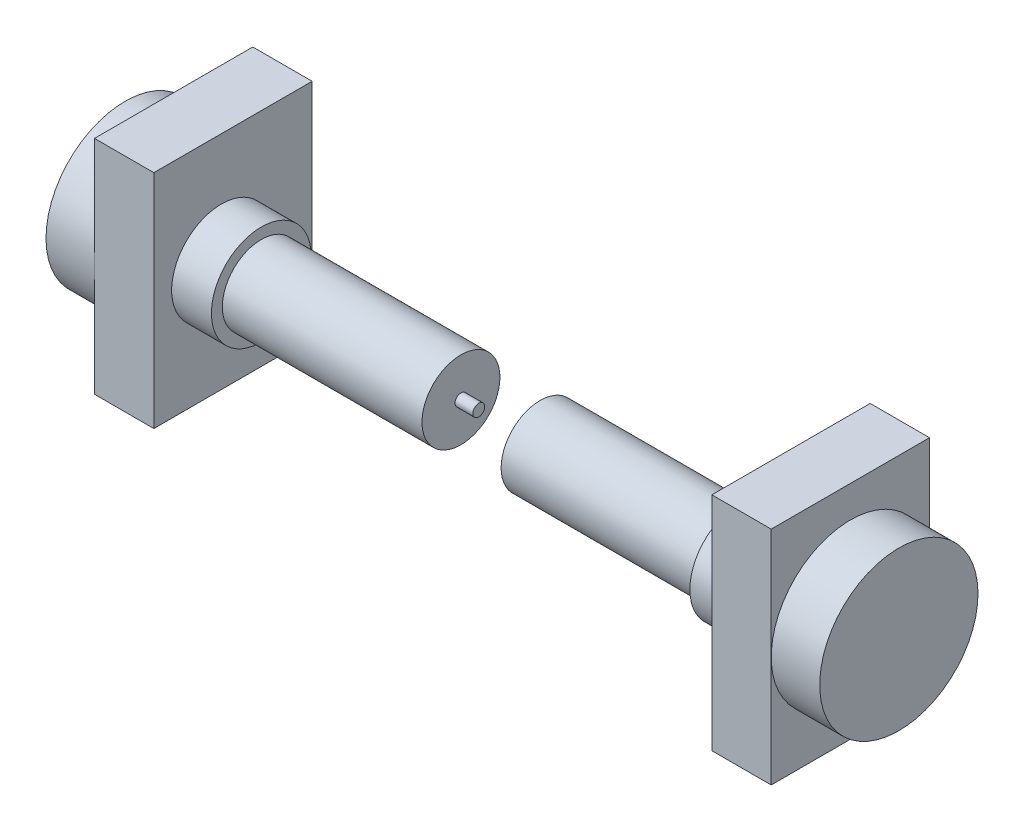
ISO-10303-21;
HEADER;
FILE_DESCRIPTION(('STEP AP214'),'2;1');
FILE_NAME('part.step','',(''),(''),'','','');
FILE_SCHEMA(('AUTOMOTIVE_DESIGN { 1 0 10303 214 1 1 1 1 }'));
ENDSEC;
DATA;
#1=APPLICATION_CONTEXT('core data for automotive mechanical design processes');
#2=APPLICATION_PROTOCOL_DEFINITION('international standard','automotive_design',2000,#1);
#3=PRODUCT_CONTEXT('',#1,'mechanical');
#4=PRODUCT('Part','Part','',(#3));
#5=PRODUCT_RELATED_PRODUCT_CATEGORY('part','',(#4));
#6=PRODUCT_DEFINITION_FORMATION('','',#4);
#7=PRODUCT_DEFINITION_CONTEXT('part definition',#1,'design');
#8=PRODUCT_DEFINITION('design','',#6,#7);
#9=PRODUCT_DEFINITION_SHAPE('','',#8);
#10=(LENGTH_UNIT() NAMED_UNIT(*) SI_UNIT(.MILLI.,.METRE.));
#11=(NAMED_UNIT(*) PLANE_ANGLE_UNIT() SI_UNIT($,.RADIAN.));
#12=(NAMED_UNIT(*) SI_UNIT($,.STERADIAN.) SOLID_ANGLE_UNIT());
#13=UNCERTAINTY_MEASURE_WITH_UNIT(LENGTH_MEASURE(1.E-05),#10,'distance_accuracy_value','');
#14=(GEOMETRIC_REPRESENTATION_CONTEXT(3) GLOBAL_UNCERTAINTY_ASSIGNED_CONTEXT((#13)) GLOBAL_UNIT_ASSIGNED_CONTEXT((#10,
#11,#12)) REPRESENTATION_CONTEXT('',''));
#15=CARTESIAN_POINT('',(0.,0.,0.));
#16=DIRECTION('',(0.,0.,1.));
#17=DIRECTION('',(1.,0.,0.));
#18=AXIS2_PLACEMENT_3D('',#15,#16,#17);
#19=CARTESIAN_POINT('',(5.5,0.,25.9));
#20=DIRECTION('',(1.,0.,0.));
#21=DIRECTION('',(0.,0.,-1.));
#22=AXIS2_PLACEMENT_3D('',#19,#20,#21);
#23=CYLINDRICAL_SURFACE('',#22,1.5);
#24=CARTESIAN_POINT('',(5.5,0.,25.9));
#25=DIRECTION('',(-1.,0.,0.));
#26=DIRECTION('',(0.,0.,1.));
#27=AXIS2_PLACEMENT_3D('',#24,#25,#26);
#28=CIRCLE('',#27,1.5);
#29=CARTESIAN_POINT('',(5.5,0.,27.4));
#30=VERTEX_POINT('',#29);
#31=EDGE_CURVE('E11',#30,#30,#28,.T.);
#32=ORIENTED_EDGE('',*,*,#31,.F.);
#33=EDGE_LOOP('',(#32));
#34=FACE_BOUND('',#33,.T.);
#35=CARTESIAN_POINT('',(10.,0.,25.9));
#36=DIRECTION('',(-1.,0.,0.));
#37=DIRECTION('',(0.,0.,1.));
#38=AXIS2_PLACEMENT_3D('',#35,#36,#37);
#39=CIRCLE('',#38,1.5);
#40=CARTESIAN_POINT('',(10.,0.,27.4));
#41=VERTEX_POINT('',#40);
#42=EDGE_CURVE('E43',#41,#41,#39,.T.);
#43=ORIENTED_EDGE('',*,*,#42,.T.);
#44=EDGE_LOOP('',(#43));
#45=FACE_BOUND('',#44,.T.);
#46=ADVANCED_FACE('F40',(#34,#45),#23,.T.);
#47=CARTESIAN_POINT('',(5.5,0.,25.9));
#48=DIRECTION('',(-1.,0.,0.));
#49=DIRECTION('',(0.,0.,1.));
#50=AXIS2_PLACEMENT_3D('',#47,#48,#49);
#51=PLANE('',#50);
#52=ORIENTED_EDGE('',*,*,#31,.T.);
#53=EDGE_LOOP('',(#52));
#54=FACE_BOUND('',#53,.T.);
#55=ADVANCED_FACE('F55',(#54),#51,.T.);
#56=CARTESIAN_POINT('',(10.,0.,25.9));
#57=DIRECTION('',(-1.,0.,0.));
#58=DIRECTION('',(0.,0.,1.));
#59=AXIS2_PLACEMENT_3D('',#56,#57,#58);
#60=PLANE('',#59);
#61=ORIENTED_EDGE('',*,*,#42,.F.);
#62=EDGE_LOOP('',(#61));
#63=FACE_BOUND('',#62,.T.);
#64=ADVANCED_FACE('F53',(#63),#60,.F.);
#65=CLOSED_SHELL('',(#46,#55,#64));
#66=MANIFOLD_SOLID_BREP('B2',#65);
#67=CARTESIAN_POINT('',(-10.,0.,25.9));
#68=DIRECTION('',(-1.,0.,0.));
#69=DIRECTION('',(0.,0.,1.));
#70=AXIS2_PLACEMENT_3D('',#67,#68,#69);
#71=CYLINDRICAL_SURFACE('',#70,9.85);
#72=CARTESIAN_POINT('',(-10.,0.,25.9));
#73=DIRECTION('',(1.,0.,0.));
#74=DIRECTION('',(0.,0.,-1.));
#75=AXIS2_PLACEMENT_3D('',#72,#73,#74);
#76=CIRCLE('',#75,9.85);
#77=CARTESIAN_POINT('',(-10.,0.,16.05));
#78=VERTEX_POINT('',#77);
#79=EDGE_CURVE('E39',#78,#78,#76,.T.);
#80=ORIENTED_EDGE('',*,*,#79,.F.);
#81=EDGE_LOOP('',(#80));
#82=FACE_BOUND('',#81,.T.);
#83=CARTESIAN_POINT('',(-60.45,0.,25.9));
#84=DIRECTION('',(1.,0.,0.));
#85=DIRECTION('',(0.,0.,-1.));
#86=AXIS2_PLACEMENT_3D('',#83,#84,#85);
#87=CIRCLE('',#86,9.85);
#88=CARTESIAN_POINT('',(-60.45,0.,16.05));
#89=VERTEX_POINT('',#88);
#90=EDGE_CURVE('E92',#89,#89,#87,.T.);
#91=ORIENTED_EDGE('',*,*,#90,.T.);
#92=EDGE_LOOP('',(#91));
#93=FACE_BOUND('',#92,.T.);
#94=ADVANCED_FACE('F89',(#82,#93),#71,.T.);
#95=CARTESIAN_POINT('',(-10.,0.,25.9));
#96=DIRECTION('',(1.,0.,0.));
#97=DIRECTION('',(0.,0.,-1.));
#98=AXIS2_PLACEMENT_3D('',#95,#96,#97);
#99=PLANE('',#98);
#100=CARTESIAN_POINT('',(-10.,0.,25.9));
#101=DIRECTION('',(1.,0.,0.));
#102=DIRECTION('',(0.,0.,-1.));
#103=AXIS2_PLACEMENT_3D('',#100,#101,#102);
#104=CIRCLE('',#103,1.5);
#105=CARTESIAN_POINT('',(-10.,0.,24.4));
#106=VERTEX_POINT('',#105);
#107=EDGE_CURVE('E101',#106,#106,#104,.T.);
#108=ORIENTED_EDGE('',*,*,#107,.F.);
#109=EDGE_LOOP('',(#108));
#110=FACE_BOUND('',#109,.T.);
#111=ORIENTED_EDGE('',*,*,#79,.T.);
#112=EDGE_LOOP('',(#111));
#113=FACE_BOUND('',#112,.T.);
#114=ADVANCED_FACE('F116',(#110,#113),#99,.T.);
#115=CARTESIAN_POINT('',(-60.45,0.,25.9));
#116=DIRECTION('',(1.,0.,0.));
#117=DIRECTION('',(0.,0.,-1.));
#118=AXIS2_PLACEMENT_3D('',#115,#116,#117);
#119=PLANE('',#118);
#120=ORIENTED_EDGE('',*,*,#90,.F.);
#121=EDGE_LOOP('',(#120));
#122=FACE_BOUND('',#121,.T.);
#123=ADVANCED_FACE('F112',(#122),#119,.F.);
#124=CARTESIAN_POINT('',(-5.5,0.,25.9));
#125=DIRECTION('',(-1.,0.,0.));
#126=DIRECTION('',(0.,0.,1.));
#127=AXIS2_PLACEMENT_3D('',#124,#125,#126);
#128=CYLINDRICAL_SURFACE('',#127,1.5);
#129=CARTESIAN_POINT('',(-5.5,0.,25.9));
#130=DIRECTION('',(1.,0.,0.));
#131=DIRECTION('',(0.,0.,-1.));
#132=AXIS2_PLACEMENT_3D('',#129,#130,#131);
#133=CIRCLE('',#132,1.5);
#134=CARTESIAN_POINT('',(-5.5,0.,24.4));
#135=VERTEX_POINT('',#134);
#136=EDGE_CURVE('E99',#135,#135,#133,.T.);
#137=ORIENTED_EDGE('',*,*,#136,.F.);
#138=EDGE_LOOP('',(#137));
#139=FACE_BOUND('',#138,.T.);
#140=ORIENTED_EDGE('',*,*,#107,.T.);
#141=EDGE_LOOP('',(#140));
#142=FACE_BOUND('',#141,.T.);
#143=ADVANCED_FACE('F109',(#139,#142),#128,.T.);
#144=CARTESIAN_POINT('',(-5.5,0.,25.9));
#145=DIRECTION('',(1.,0.,0.));
#146=DIRECTION('',(0.,0.,-1.));
#147=AXIS2_PLACEMENT_3D('',#144,#145,#146);
#148=PLANE('',#147);
#149=ORIENTED_EDGE('',*,*,#136,.T.);
#150=EDGE_LOOP('',(#149));
#151=FACE_BOUND('',#150,.T.);
#152=ADVANCED_FACE('F107',(#151),#148,.T.);
#153=CLOSED_SHELL('',(#94,#114,#123,#143,#152));
#154=MANIFOLD_SOLID_BREP('B6',#153);
#155=CARTESIAN_POINT('',(10.,0.,25.9));
#156=DIRECTION('',(1.,0.,0.));
#157=DIRECTION('',(0.,0.,-1.));
#158=AXIS2_PLACEMENT_3D('',#155,#156,#157);
#159=CYLINDRICAL_SURFACE('',#158,9.85);
#160=CARTESIAN_POINT('',(10.,0.,25.9));
#161=DIRECTION('',(-1.,0.,0.));
#162=DIRECTION('',(0.,0.,1.));
#163=AXIS2_PLACEMENT_3D('',#160,#161,#162);
#164=CIRCLE('',#163,9.85);
#165=CARTESIAN_POINT('',(10.,0.,35.75));
#166=VERTEX_POINT('',#165);
#167=EDGE_CURVE('E88',#166,#166,#164,.T.);
#168=ORIENTED_EDGE('',*,*,#167,.F.);
#169=EDGE_LOOP('',(#168));
#170=FACE_BOUND('',#169,.T.);
#171=CARTESIAN_POINT('',(60.45,0.,25.9));
#172=DIRECTION('',(-1.,0.,0.));
#173=DIRECTION('',(0.,0.,1.));
#174=AXIS2_PLACEMENT_3D('',#171,#172,#173);
#175=CIRCLE('',#174,9.85);
#176=CARTESIAN_POINT('',(60.45,0.,35.75));
#177=VERTEX_POINT('',#176);
#178=EDGE_CURVE('E171',#177,#177,#175,.T.);
#179=ORIENTED_EDGE('',*,*,#178,.T.);
#180=EDGE_LOOP('',(#179));
#181=FACE_BOUND('',#180,.T.);
#182=ADVANCED_FACE('F168',(#170,#181),#159,.T.);
#183=CARTESIAN_POINT('',(10.,0.,25.9));
#184=DIRECTION('',(-1.,0.,0.));
#185=DIRECTION('',(0.,0.,1.));
#186=AXIS2_PLACEMENT_3D('',#183,#184,#185);
#187=PLANE('',#186);
#188=ORIENTED_EDGE('',*,*,#167,.T.);
#189=EDGE_LOOP('',(#188));
#190=FACE_BOUND('',#189,.T.);
#191=ADVANCED_FACE('F183',(#190),#187,.T.);
#192=CARTESIAN_POINT('',(60.45,0.,25.9));
#193=DIRECTION('',(-1.,0.,0.));
#194=DIRECTION('',(0.,0.,1.));
#195=AXIS2_PLACEMENT_3D('',#192,#193,#194);
#196=PLANE('',#195);
#197=ORIENTED_EDGE('',*,*,#178,.F.);
#198=EDGE_LOOP('',(#197));
#199=FACE_BOUND('',#198,.T.);
#200=ADVANCED_FACE('F181',(#199),#196,.F.);
#201=CLOSED_SHELL('',(#182,#191,#200));
#202=MANIFOLD_SOLID_BREP('B34',#201);
#203=CARTESIAN_POINT('',(-60.45,0.,25.9));
#204=DIRECTION('',(-1.,0.,0.));
#205=DIRECTION('',(0.,0.,1.));
#206=AXIS2_PLACEMENT_3D('',#203,#204,#205);
#207=CYLINDRICAL_SURFACE('',#206,12.6);
#208=CARTESIAN_POINT('',(-60.45,0.,25.9));
#209=DIRECTION('',(1.,0.,0.));
#210=DIRECTION('',(0.,0.,-1.));
#211=AXIS2_PLACEMENT_3D('',#208,#209,#210);
#212=CIRCLE('',#211,12.6);
#213=CARTESIAN_POINT('',(-60.45,0.,13.3));
#214=VERTEX_POINT('',#213);
#215=EDGE_CURVE('E167',#214,#214,#212,.T.);
#216=ORIENTED_EDGE('',*,*,#215,.F.);
#217=EDGE_LOOP('',(#216));
#218=FACE_BOUND('',#217,.T.);
#219=CARTESIAN_POINT('',(-70.5,0.,25.9));
#220=DIRECTION('',(1.,0.,0.));
#221=DIRECTION('',(0.,0.,-1.));
#222=AXIS2_PLACEMENT_3D('',#219,#220,#221);
#223=CIRCLE('',#222,12.6);
#224=CARTESIAN_POINT('',(-70.5,0.,13.3));
#225=VERTEX_POINT('',#224);
#226=EDGE_CURVE('E220',#225,#225,#223,.T.);
#227=ORIENTED_EDGE('',*,*,#226,.T.);
#228=EDGE_LOOP('',(#227));
#229=FACE_BOUND('',#228,.T.);
#230=ADVANCED_FACE('F217',(#218,#229),#207,.T.);
#231=CARTESIAN_POINT('',(-60.45,0.,25.9));
#232=DIRECTION('',(1.,0.,0.));
#233=DIRECTION('',(0.,0.,-1.));
#234=AXIS2_PLACEMENT_3D('',#231,#232,#233);
#235=PLANE('',#234);
#236=ORIENTED_EDGE('',*,*,#215,.T.);
#237=EDGE_LOOP('',(#236));
#238=FACE_BOUND('',#237,.T.);
#239=ADVANCED_FACE('F232',(#238),#235,.T.);
#240=CARTESIAN_POINT('',(-70.5,0.,25.9));
#241=DIRECTION('',(1.,0.,0.));
#242=DIRECTION('',(0.,0.,-1.));
#243=AXIS2_PLACEMENT_3D('',#240,#241,#242);
#244=PLANE('',#243);
#245=ORIENTED_EDGE('',*,*,#226,.F.);
#246=EDGE_LOOP('',(#245));
#247=FACE_BOUND('',#246,.T.);
#248=ADVANCED_FACE('F230',(#247),#244,.F.);
#249=CLOSED_SHELL('',(#230,#239,#248));
#250=MANIFOLD_SOLID_BREP('B83',#249);
#251=CARTESIAN_POINT('',(60.45,0.,25.9));
#252=DIRECTION('',(1.,0.,0.));
#253=DIRECTION('',(0.,0.,-1.));
#254=AXIS2_PLACEMENT_3D('',#251,#252,#253);
#255=CYLINDRICAL_SURFACE('',#254,12.6);
#256=CARTESIAN_POINT('',(60.45,0.,25.9));
#257=DIRECTION('',(-1.,0.,0.));
#258=DIRECTION('',(0.,0.,1.));
#259=AXIS2_PLACEMENT_3D('',#256,#257,#258);
#260=CIRCLE('',#259,12.6);
#261=CARTESIAN_POINT('',(60.45,0.,38.5));
#262=VERTEX_POINT('',#261);
#263=EDGE_CURVE('E216',#262,#262,#260,.T.);
#264=ORIENTED_EDGE('',*,*,#263,.F.);
#265=EDGE_LOOP('',(#264));
#266=FACE_BOUND('',#265,.T.);
#267=CARTESIAN_POINT('',(70.5,0.,25.9));
#268=DIRECTION('',(-1.,0.,0.));
#269=DIRECTION('',(0.,0.,1.));
#270=AXIS2_PLACEMENT_3D('',#267,#268,#269);
#271=CIRCLE('',#270,12.6);
#272=CARTESIAN_POINT('',(70.5,0.,38.5));
#273=VERTEX_POINT('',#272);
#274=EDGE_CURVE('E269',#273,#273,#271,.T.);
#275=ORIENTED_EDGE('',*,*,#274,.T.);
#276=EDGE_LOOP('',(#275));
#277=FACE_BOUND('',#276,.T.);
#278=ADVANCED_FACE('F266',(#266,#277),#255,.T.);
#279=CARTESIAN_POINT('',(60.45,0.,25.9));
#280=DIRECTION('',(-1.,0.,0.));
#281=DIRECTION('',(0.,0.,1.));
#282=AXIS2_PLACEMENT_3D('',#279,#280,#281);
#283=PLANE('',#282);
#284=ORIENTED_EDGE('',*,*,#263,.T.);
#285=EDGE_LOOP('',(#284));
#286=FACE_BOUND('',#285,.T.);
#287=ADVANCED_FACE('F281',(#286),#283,.T.);
#288=CARTESIAN_POINT('',(70.5,0.,25.9));
#289=DIRECTION('',(-1.,0.,0.));
#290=DIRECTION('',(0.,0.,1.));
#291=AXIS2_PLACEMENT_3D('',#288,#289,#290);
#292=PLANE('',#291);
#293=ORIENTED_EDGE('',*,*,#274,.F.);
#294=EDGE_LOOP('',(#293));
#295=FACE_BOUND('',#294,.T.);
#296=ADVANCED_FACE('F279',(#295),#292,.F.);
#297=CLOSED_SHELL('',(#278,#287,#296));
#298=MANIFOLD_SOLID_BREP('B162',#297);
#299=CARTESIAN_POINT('',(97.75,0.,23.));
#300=DIRECTION('',(-1.,0.,0.));
#301=DIRECTION('',(0.,0.,1.));
#302=AXIS2_PLACEMENT_3D('',#299,#300,#301);
#303=CYLINDRICAL_SURFACE('',#302,20.);
#304=CARTESIAN_POINT('',(97.75,0.,23.));
#305=DIRECTION('',(1.,0.,0.));
#306=DIRECTION('',(0.,0.,-1.));
#307=AXIS2_PLACEMENT_3D('',#304,#305,#306);
#308=CIRCLE('',#307,20.);
#309=CARTESIAN_POINT('',(97.75,0.,3.));
#310=VERTEX_POINT('',#309);
#311=EDGE_CURVE('E265',#310,#310,#308,.T.);
#312=ORIENTED_EDGE('',*,*,#311,.F.);
#313=EDGE_LOOP('',(#312));
#314=FACE_BOUND('',#313,.T.);
#315=CARTESIAN_POINT('',(85.5,0.,23.));
#316=DIRECTION('',(1.,0.,0.));
#317=DIRECTION('',(0.,0.,-1.));
#318=AXIS2_PLACEMENT_3D('',#315,#316,#317);
#319=CIRCLE('',#318,20.);
#320=CARTESIAN_POINT('',(85.5,0.,3.));
#321=VERTEX_POINT('',#320);
#322=EDGE_CURVE('E318',#321,#321,#319,.T.);
#323=ORIENTED_EDGE('',*,*,#322,.T.);
#324=EDGE_LOOP('',(#323));
#325=FACE_BOUND('',#324,.T.);
#326=ADVANCED_FACE('F315',(#314,#325),#303,.T.);
#327=CARTESIAN_POINT('',(97.75,0.,23.));
#328=DIRECTION('',(1.,0.,0.));
#329=DIRECTION('',(0.,0.,-1.));
#330=AXIS2_PLACEMENT_3D('',#327,#328,#329);
#331=PLANE('',#330);
#332=ORIENTED_EDGE('',*,*,#311,.T.);
#333=EDGE_LOOP('',(#332));
#334=FACE_BOUND('',#333,.T.);
#335=ADVANCED_FACE('F330',(#334),#331,.T.);
#336=CARTESIAN_POINT('',(85.5,0.,23.));
#337=DIRECTION('',(1.,0.,0.));
#338=DIRECTION('',(0.,0.,-1.));
#339=AXIS2_PLACEMENT_3D('',#336,#337,#338);
#340=PLANE('',#339);
#341=ORIENTED_EDGE('',*,*,#322,.F.);
#342=EDGE_LOOP('',(#341));
#343=FACE_BOUND('',#342,.T.);
#344=ADVANCED_FACE('F328',(#343),#340,.F.);
#345=CLOSED_SHELL('',(#326,#335,#344));
#346=MANIFOLD_SOLID_BREP('B211',#345);
#347=CARTESIAN_POINT('',(-97.75,0.,23.));
#348=DIRECTION('',(1.,0.,0.));
#349=DIRECTION('',(0.,0.,-1.));
#350=AXIS2_PLACEMENT_3D('',#347,#348,#349);
#351=CYLINDRICAL_SURFACE('',#350,20.);
#352=CARTESIAN_POINT('',(-97.75,0.,23.));
#353=DIRECTION('',(-1.,0.,0.));
#354=DIRECTION('',(0.,0.,1.));
#355=AXIS2_PLACEMENT_3D('',#352,#353,#354);
#356=CIRCLE('',#355,20.);
#357=CARTESIAN_POINT('',(-97.75,0.,43.));
#358=VERTEX_POINT('',#357);
#359=EDGE_CURVE('E314',#358,#358,#356,.T.);
#360=ORIENTED_EDGE('',*,*,#359,.F.);
#361=EDGE_LOOP('',(#360));
#362=FACE_BOUND('',#361,.T.);
#363=CARTESIAN_POINT('',(-85.5,0.,23.));
#364=DIRECTION('',(-1.,0.,0.));
#365=DIRECTION('',(0.,0.,1.));
#366=AXIS2_PLACEMENT_3D('',#363,#364,#365);
#367=CIRCLE('',#366,20.);
#368=CARTESIAN_POINT('',(-85.5,0.,43.));
#369=VERTEX_POINT('',#368);
#370=EDGE_CURVE('E369',#369,#369,#367,.T.);
#371=ORIENTED_EDGE('',*,*,#370,.T.);
#372=EDGE_LOOP('',(#371));
#373=FACE_BOUND('',#372,.T.);
#374=ADVANCED_FACE('F366',(#362,#373),#351,.T.);
#375=CARTESIAN_POINT('',(-97.75,0.,23.));
#376=DIRECTION('',(-1.,0.,0.));
#377=DIRECTION('',(0.,0.,1.));
#378=AXIS2_PLACEMENT_3D('',#375,#376,#377);
#379=PLANE('',#378);
#380=ORIENTED_EDGE('',*,*,#359,.T.);
#381=EDGE_LOOP('',(#380));
#382=FACE_BOUND('',#381,.T.);
#383=ADVANCED_FACE('F381',(#382),#379,.T.);
#384=CARTESIAN_POINT('',(-85.5,0.,23.));
#385=DIRECTION('',(-1.,0.,0.));
#386=DIRECTION('',(0.,0.,1.));
#387=AXIS2_PLACEMENT_3D('',#384,#385,#386);
#388=PLANE('',#387);
#389=ORIENTED_EDGE('',*,*,#370,.F.);
#390=EDGE_LOOP('',(#389));
#391=FACE_BOUND('',#390,.T.);
#392=ADVANCED_FACE('F379',(#391),#388,.F.);
#393=CLOSED_SHELL('',(#374,#383,#392));
#394=MANIFOLD_SOLID_BREP('B260',#393);
#395=CARTESIAN_POINT('',(85.5,28.,43.));
#396=DIRECTION('',(-1.,0.,0.));
#397=DIRECTION('',(0.,0.,1.));
#398=AXIS2_PLACEMENT_3D('',#395,#396,#397);
#399=PLANE('',#398);
#400=DIRECTION('',(0.,1.,0.));
#401=VECTOR('',#400,1.);
#402=CARTESIAN_POINT('',(85.5,28.,3.));
#403=LINE('',#402,#401);
#404=CARTESIAN_POINT('',(85.5,-28.,3.));
#405=VERTEX_POINT('',#404);
#406=CARTESIAN_POINT('',(85.5,28.,3.));
#407=VERTEX_POINT('',#406);
#408=EDGE_CURVE('E479',#405,#407,#403,.T.);
#409=ORIENTED_EDGE('',*,*,#408,.T.);
#410=DIRECTION('',(0.,0.,-1.));
#411=VECTOR('',#410,1.);
#412=CARTESIAN_POINT('',(85.5,28.,43.));
#413=LINE('',#412,#411);
#414=CARTESIAN_POINT('',(85.5,28.,43.));
#415=VERTEX_POINT('',#414);
#416=EDGE_CURVE('E364',#415,#407,#413,.T.);
#417=ORIENTED_EDGE('',*,*,#416,.F.);
#418=DIRECTION('',(0.,1.,0.));
#419=VECTOR('',#418,1.);
#420=CARTESIAN_POINT('',(85.5,28.,43.));
#421=LINE('',#420,#419);
#422=CARTESIAN_POINT('',(85.5,-28.,43.));
#423=VERTEX_POINT('',#422);
#424=EDGE_CURVE('E467',#423,#415,#421,.T.);
#425=ORIENTED_EDGE('',*,*,#424,.F.);
#426=DIRECTION('',(0.,0.,-1.));
#427=VECTOR('',#426,1.);
#428=CARTESIAN_POINT('',(85.5,-28.,43.));
#429=LINE('',#428,#427);
#430=EDGE_CURVE('E475',#423,#405,#429,.T.);
#431=ORIENTED_EDGE('',*,*,#430,.T.);
#432=EDGE_LOOP('',(#409,#417,#425,#431));
#433=FACE_BOUND('',#432,.T.);
#434=ADVANCED_FACE('F416',(#433),#399,.F.);
#435=CARTESIAN_POINT('',(85.5,28.,43.));
#436=DIRECTION('',(0.,-1.,0.));
#437=DIRECTION('',(0.,0.,-1.));
#438=AXIS2_PLACEMENT_3D('',#435,#436,#437);
#439=PLANE('',#438);
#440=DIRECTION('',(-1.,0.,0.));
#441=VECTOR('',#440,1.);
#442=CARTESIAN_POINT('',(85.5,28.,3.));
#443=LINE('',#442,#441);
#444=CARTESIAN_POINT('',(70.5,28.,3.));
#445=VERTEX_POINT('',#444);
#446=EDGE_CURVE('E471',#407,#445,#443,.T.);
#447=ORIENTED_EDGE('',*,*,#446,.T.);
#448=DIRECTION('',(0.,0.,-1.));
#449=VECTOR('',#448,1.);
#450=CARTESIAN_POINT('',(70.5,28.,43.));
#451=LINE('',#450,#449);
#452=CARTESIAN_POINT('',(70.5,28.,43.));
#453=VERTEX_POINT('',#452);
#454=EDGE_CURVE('E424',#453,#445,#451,.T.);
#455=ORIENTED_EDGE('',*,*,#454,.F.);
#456=DIRECTION('',(-1.,0.,0.));
#457=VECTOR('',#456,1.);
#458=CARTESIAN_POINT('',(85.5,28.,43.));
#459=LINE('',#458,#457);
#460=EDGE_CURVE('E462',#415,#453,#459,.T.);
#461=ORIENTED_EDGE('',*,*,#460,.F.);
#462=ORIENTED_EDGE('',*,*,#416,.T.);
#463=EDGE_LOOP('',(#447,#455,#461,#462));
#464=FACE_BOUND('',#463,.T.);
#465=ADVANCED_FACE('F470',(#464),#439,.F.);
#466=CARTESIAN_POINT('',(70.5,28.,43.));
#467=DIRECTION('',(1.,0.,0.));
#468=DIRECTION('',(0.,0.,-1.));
#469=AXIS2_PLACEMENT_3D('',#466,#467,#468);
#470=PLANE('',#469);
#471=DIRECTION('',(0.,-1.,0.));
#472=VECTOR('',#471,1.);
#473=CARTESIAN_POINT('',(70.5,28.,3.));
#474=LINE('',#473,#472);
#475=CARTESIAN_POINT('',(70.5,-28.,3.));
#476=VERTEX_POINT('',#475);
#477=EDGE_CURVE('E449',#445,#476,#474,.T.);
#478=ORIENTED_EDGE('',*,*,#477,.T.);
#479=DIRECTION('',(0.,0.,-1.));
#480=VECTOR('',#479,1.);
#481=CARTESIAN_POINT('',(70.5,-28.,43.));
#482=LINE('',#481,#480);
#483=CARTESIAN_POINT('',(70.5,-28.,43.));
#484=VERTEX_POINT('',#483);
#485=EDGE_CURVE('E472',#484,#476,#482,.T.);
#486=ORIENTED_EDGE('',*,*,#485,.F.);
#487=DIRECTION('',(0.,-1.,0.));
#488=VECTOR('',#487,1.);
#489=CARTESIAN_POINT('',(70.5,28.,43.));
#490=LINE('',#489,#488);
#491=EDGE_CURVE('E465',#453,#484,#490,.T.);
#492=ORIENTED_EDGE('',*,*,#491,.F.);
#493=ORIENTED_EDGE('',*,*,#454,.T.);
#494=EDGE_LOOP('',(#478,#486,#492,#493));
#495=FACE_BOUND('',#494,.T.);
#496=ADVANCED_FACE('F473',(#495),#470,.F.);
#497=CARTESIAN_POINT('',(85.5,-28.,43.));
#498=DIRECTION('',(0.,1.,0.));
#499=DIRECTION('',(0.,0.,1.));
#500=AXIS2_PLACEMENT_3D('',#497,#498,#499);
#501=PLANE('',#500);
#502=DIRECTION('',(1.,0.,0.));
#503=VECTOR('',#502,1.);
#504=CARTESIAN_POINT('',(85.5,-28.,3.));
#505=LINE('',#504,#503);
#506=EDGE_CURVE('E455',#476,#405,#505,.T.);
#507=ORIENTED_EDGE('',*,*,#506,.T.);
#508=ORIENTED_EDGE('',*,*,#430,.F.);
#509=DIRECTION('',(1.,0.,0.));
#510=VECTOR('',#509,1.);
#511=CARTESIAN_POINT('',(85.5,-28.,43.));
#512=LINE('',#511,#510);
#513=EDGE_CURVE('E432',#484,#423,#512,.T.);
#514=ORIENTED_EDGE('',*,*,#513,.F.);
#515=ORIENTED_EDGE('',*,*,#485,.T.);
#516=EDGE_LOOP('',(#507,#508,#514,#515));
#517=FACE_BOUND('',#516,.T.);
#518=ADVANCED_FACE('F486',(#517),#501,.F.);
#519=CARTESIAN_POINT('',(0.,0.,43.));
#520=DIRECTION('',(0.,0.,-1.));
#521=DIRECTION('',(-1.,0.,0.));
#522=AXIS2_PLACEMENT_3D('',#519,#520,#521);
#523=PLANE('',#522);
#524=ORIENTED_EDGE('',*,*,#424,.T.);
#525=ORIENTED_EDGE('',*,*,#460,.T.);
#526=ORIENTED_EDGE('',*,*,#491,.T.);
#527=ORIENTED_EDGE('',*,*,#513,.T.);
#528=EDGE_LOOP('',(#524,#525,#526,#527));
#529=FACE_BOUND('',#528,.T.);
#530=ADVANCED_FACE('F463',(#529),#523,.F.);
#531=CARTESIAN_POINT('',(0.,0.,3.));
#532=DIRECTION('',(0.,0.,-1.));
#533=DIRECTION('',(-1.,0.,0.));
#534=AXIS2_PLACEMENT_3D('',#531,#532,#533);
#535=PLANE('',#534);
#536=ORIENTED_EDGE('',*,*,#408,.F.);
#537=ORIENTED_EDGE('',*,*,#506,.F.);
#538=ORIENTED_EDGE('',*,*,#477,.F.);
#539=ORIENTED_EDGE('',*,*,#446,.F.);
#540=EDGE_LOOP('',(#536,#537,#538,#539));
#541=FACE_BOUND('',#540,.T.);
#542=ADVANCED_FACE('F489',(#541),#535,.T.);
#543=CLOSED_SHELL('',(#434,#465,#496,#518,#530,#542));
#544=MANIFOLD_SOLID_BREP('B309',#543);
#545=CARTESIAN_POINT('',(-85.5,28.,43.));
#546=DIRECTION('',(1.,0.,0.));
#547=DIRECTION('',(0.,0.,-1.));
#548=AXIS2_PLACEMENT_3D('',#545,#546,#547);
#549=PLANE('',#548);
#550=DIRECTION('',(0.,-1.,0.));
#551=VECTOR('',#550,1.);
#552=CARTESIAN_POINT('',(-85.5,28.,3.));
#553=LINE('',#552,#551);
#554=CARTESIAN_POINT('',(-85.5,28.,3.));
#555=VERTEX_POINT('',#554);
#556=CARTESIAN_POINT('',(-85.5,-28.,3.));
#557=VERTEX_POINT('',#556);
#558=EDGE_CURVE('E603',#555,#557,#553,.T.);
#559=ORIENTED_EDGE('',*,*,#558,.T.);
#560=DIRECTION('',(0.,0.,-1.));
#561=VECTOR('',#560,1.);
#562=CARTESIAN_POINT('',(-85.5,-28.,43.));
#563=LINE('',#562,#561);
#564=CARTESIAN_POINT('',(-85.5,-28.,43.));
#565=VERTEX_POINT('',#564);
#566=EDGE_CURVE('E414',#565,#557,#563,.T.);
#567=ORIENTED_EDGE('',*,*,#566,.F.);
#568=DIRECTION('',(0.,-1.,0.));
#569=VECTOR('',#568,1.);
#570=CARTESIAN_POINT('',(-85.5,28.,43.));
#571=LINE('',#570,#569);
#572=CARTESIAN_POINT('',(-85.5,28.,43.));
#573=VERTEX_POINT('',#572);
#574=EDGE_CURVE('E591',#573,#565,#571,.T.);
#575=ORIENTED_EDGE('',*,*,#574,.F.);
#576=DIRECTION('',(0.,0.,-1.));
#577=VECTOR('',#576,1.);
#578=CARTESIAN_POINT('',(-85.5,28.,43.));
#579=LINE('',#578,#577);
#580=EDGE_CURVE('E599',#573,#555,#579,.T.);
#581=ORIENTED_EDGE('',*,*,#580,.T.);
#582=EDGE_LOOP('',(#559,#567,#575,#581));
#583=FACE_BOUND('',#582,.T.);
#584=ADVANCED_FACE('F540',(#583),#549,.F.);
#585=CARTESIAN_POINT('',(-85.5,-28.,43.));
#586=DIRECTION('',(0.,1.,0.));
#587=DIRECTION('',(0.,0.,1.));
#588=AXIS2_PLACEMENT_3D('',#585,#586,#587);
#589=PLANE('',#588);
#590=DIRECTION('',(1.,0.,0.));
#591=VECTOR('',#590,1.);
#592=CARTESIAN_POINT('',(-85.5,-28.,3.));
#593=LINE('',#592,#591);
#594=CARTESIAN_POINT('',(-70.5,-28.,3.));
#595=VERTEX_POINT('',#594);
#596=EDGE_CURVE('E595',#557,#595,#593,.T.);
#597=ORIENTED_EDGE('',*,*,#596,.T.);
#598=DIRECTION('',(0.,0.,-1.));
#599=VECTOR('',#598,1.);
#600=CARTESIAN_POINT('',(-70.5,-28.,43.));
#601=LINE('',#600,#599);
#602=CARTESIAN_POINT('',(-70.5,-28.,43.));
#603=VERTEX_POINT('',#602);
#604=EDGE_CURVE('E548',#603,#595,#601,.T.);
#605=ORIENTED_EDGE('',*,*,#604,.F.);
#606=DIRECTION('',(1.,0.,0.));
#607=VECTOR('',#606,1.);
#608=CARTESIAN_POINT('',(-85.5,-28.,43.));
#609=LINE('',#608,#607);
#610=EDGE_CURVE('E586',#565,#603,#609,.T.);
#611=ORIENTED_EDGE('',*,*,#610,.F.);
#612=ORIENTED_EDGE('',*,*,#566,.T.);
#613=EDGE_LOOP('',(#597,#605,#611,#612));
#614=FACE_BOUND('',#613,.T.);
#615=ADVANCED_FACE('F594',(#614),#589,.F.);
#616=CARTESIAN_POINT('',(-70.5,28.,43.));
#617=DIRECTION('',(-1.,0.,0.));
#618=DIRECTION('',(0.,0.,1.));
#619=AXIS2_PLACEMENT_3D('',#616,#617,#618);
#620=PLANE('',#619);
#621=DIRECTION('',(0.,1.,0.));
#622=VECTOR('',#621,1.);
#623=CARTESIAN_POINT('',(-70.5,28.,3.));
#624=LINE('',#623,#622);
#625=CARTESIAN_POINT('',(-70.5,28.,3.));
#626=VERTEX_POINT('',#625);
#627=EDGE_CURVE('E573',#595,#626,#624,.T.);
#628=ORIENTED_EDGE('',*,*,#627,.T.);
#629=DIRECTION('',(0.,0.,-1.));
#630=VECTOR('',#629,1.);
#631=CARTESIAN_POINT('',(-70.5,28.,43.));
#632=LINE('',#631,#630);
#633=CARTESIAN_POINT('',(-70.5,28.,43.));
#634=VERTEX_POINT('',#633);
#635=EDGE_CURVE('E596',#634,#626,#632,.T.);
#636=ORIENTED_EDGE('',*,*,#635,.F.);
#637=DIRECTION('',(0.,1.,0.));
#638=VECTOR('',#637,1.);
#639=CARTESIAN_POINT('',(-70.5,28.,43.));
#640=LINE('',#639,#638);
#641=EDGE_CURVE('E589',#603,#634,#640,.T.);
#642=ORIENTED_EDGE('',*,*,#641,.F.);
#643=ORIENTED_EDGE('',*,*,#604,.T.);
#644=EDGE_LOOP('',(#628,#636,#642,#643));
#645=FACE_BOUND('',#644,.T.);
#646=ADVANCED_FACE('F597',(#645),#620,.F.);
#647=CARTESIAN_POINT('',(-85.5,28.,43.));
#648=DIRECTION('',(0.,-1.,0.));
#649=DIRECTION('',(0.,0.,-1.));
#650=AXIS2_PLACEMENT_3D('',#647,#648,#649);
#651=PLANE('',#650);
#652=DIRECTION('',(-1.,0.,0.));
#653=VECTOR('',#652,1.);
#654=CARTESIAN_POINT('',(-85.5,28.,3.));
#655=LINE('',#654,#653);
#656=EDGE_CURVE('E579',#626,#555,#655,.T.);
#657=ORIENTED_EDGE('',*,*,#656,.T.);
#658=ORIENTED_EDGE('',*,*,#580,.F.);
#659=DIRECTION('',(-1.,0.,0.));
#660=VECTOR('',#659,1.);
#661=CARTESIAN_POINT('',(-85.5,28.,43.));
#662=LINE('',#661,#660);
#663=EDGE_CURVE('E556',#634,#573,#662,.T.);
#664=ORIENTED_EDGE('',*,*,#663,.F.);
#665=ORIENTED_EDGE('',*,*,#635,.T.);
#666=EDGE_LOOP('',(#657,#658,#664,#665));
#667=FACE_BOUND('',#666,.T.);
#668=ADVANCED_FACE('F610',(#667),#651,.F.);
#669=CARTESIAN_POINT('',(0.,0.,43.));
#670=DIRECTION('',(0.,0.,1.));
#671=DIRECTION('',(1.,0.,0.));
#672=AXIS2_PLACEMENT_3D('',#669,#670,#671);
#673=PLANE('',#672);
#674=ORIENTED_EDGE('',*,*,#574,.T.);
#675=ORIENTED_EDGE('',*,*,#610,.T.);
#676=ORIENTED_EDGE('',*,*,#641,.T.);
#677=ORIENTED_EDGE('',*,*,#663,.T.);
#678=EDGE_LOOP('',(#674,#675,#676,#677));
#679=FACE_BOUND('',#678,.T.);
#680=ADVANCED_FACE('F587',(#679),#673,.T.);
#681=CARTESIAN_POINT('',(0.,0.,3.));
#682=DIRECTION('',(0.,0.,1.));
#683=DIRECTION('',(1.,0.,0.));
#684=AXIS2_PLACEMENT_3D('',#681,#682,#683);
#685=PLANE('',#684);
#686=ORIENTED_EDGE('',*,*,#558,.F.);
#687=ORIENTED_EDGE('',*,*,#656,.F.);
#688=ORIENTED_EDGE('',*,*,#627,.F.);
#689=ORIENTED_EDGE('',*,*,#596,.F.);
#690=EDGE_LOOP('',(#686,#687,#688,#689));
#691=FACE_BOUND('',#690,.T.);
#692=ADVANCED_FACE('F613',(#691),#685,.F.);
#693=CLOSED_SHELL('',(#584,#615,#646,#668,#680,#692));
#694=MANIFOLD_SOLID_BREP('B358',#693);
#695=ADVANCED_BREP_SHAPE_REPRESENTATION('',(#18,#66,#154,#202,#250,#298,#346,#394,#544,#694),#14);
#696=SHAPE_DEFINITION_REPRESENTATION(#9,#695);
ENDSEC;
END-ISO-10303-21;
